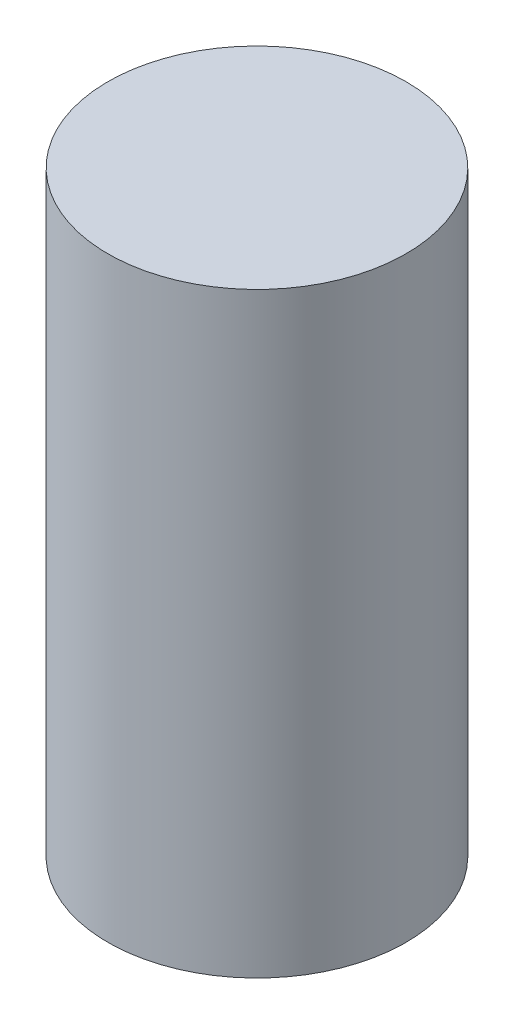
ISO-10303-21;
HEADER;
FILE_DESCRIPTION(('STEP AP214'),'2;1');
FILE_NAME('part.step','',(''),(''),'','','');
FILE_SCHEMA(('AUTOMOTIVE_DESIGN { 1 0 10303 214 1 1 1 1 }'));
ENDSEC;
DATA;
#1=APPLICATION_CONTEXT('core data for automotive mechanical design processes');
#2=APPLICATION_PROTOCOL_DEFINITION('international standard','automotive_design',2000,#1);
#3=PRODUCT_CONTEXT('',#1,'mechanical');
#4=PRODUCT('Part','Part','',(#3));
#5=PRODUCT_RELATED_PRODUCT_CATEGORY('part','',(#4));
#6=PRODUCT_DEFINITION_FORMATION('','',#4);
#7=PRODUCT_DEFINITION_CONTEXT('part definition',#1,'design');
#8=PRODUCT_DEFINITION('design','',#6,#7);
#9=PRODUCT_DEFINITION_SHAPE('','',#8);
#10=(LENGTH_UNIT() NAMED_UNIT(*) SI_UNIT(.MILLI.,.METRE.));
#11=(NAMED_UNIT(*) PLANE_ANGLE_UNIT() SI_UNIT($,.RADIAN.));
#12=(NAMED_UNIT(*) SI_UNIT($,.STERADIAN.) SOLID_ANGLE_UNIT());
#13=UNCERTAINTY_MEASURE_WITH_UNIT(LENGTH_MEASURE(1.E-05),#10,'distance_accuracy_value','');
#14=(GEOMETRIC_REPRESENTATION_CONTEXT(3) GLOBAL_UNCERTAINTY_ASSIGNED_CONTEXT((#13)) GLOBAL_UNIT_ASSIGNED_CONTEXT((#10,
#11,#12)) REPRESENTATION_CONTEXT('',''));
#15=CARTESIAN_POINT('',(0.,0.,0.));
#16=DIRECTION('',(0.,0.,1.));
#17=DIRECTION('',(1.,0.,0.));
#18=AXIS2_PLACEMENT_3D('',#15,#16,#17);
#19=CARTESIAN_POINT('',(0.,58.,0.));
#20=DIRECTION('',(0.,-1.,0.));
#21=DIRECTION('',(0.,0.,-1.));
#22=AXIS2_PLACEMENT_3D('',#19,#20,#21);
#23=CYLINDRICAL_SURFACE('',#22,14.5);
#24=CARTESIAN_POINT('',(0.,58.,0.));
#25=DIRECTION('',(0.,1.,0.));
#26=DIRECTION('',(0.,0.,1.));
#27=AXIS2_PLACEMENT_3D('',#24,#25,#26);
#28=CIRCLE('',#27,14.5);
#29=CARTESIAN_POINT('',(0.,58.,-14.5));
#30=VERTEX_POINT('',#29);
#31=EDGE_CURVE('E10',#30,#30,#28,.T.);
#32=CARTESIAN_POINT('',(0.,0.,0.));
#33=DIRECTION('',(0.,1.,0.));
#34=DIRECTION('',(0.,0.,1.));
#35=AXIS2_PLACEMENT_3D('',#32,#33,#34);
#36=CIRCLE('',#35,14.5);
#37=CARTESIAN_POINT('',(0.,0.,-14.5));
#38=VERTEX_POINT('',#37);
#39=EDGE_CURVE('E44',#38,#38,#36,.T.);
#40=CARTESIAN_POINT('',(0.,58.,-14.5));
#41=CARTESIAN_POINT('',(0.,57.3958333333333,-14.5));
#42=CARTESIAN_POINT('',(0.,56.7916666666667,-14.5));
#43=CARTESIAN_POINT('',(0.,55.5833333333333,-14.5));
#44=CARTESIAN_POINT('',(0.,54.9791666666667,-14.5));
#45=CARTESIAN_POINT('',(0.,53.7708333333333,-14.5));
#46=CARTESIAN_POINT('',(0.,53.1666666666667,-14.5));
#47=CARTESIAN_POINT('',(0.,51.9583333333333,-14.5));
#48=CARTESIAN_POINT('',(0.,51.3541666666667,-14.5));
#49=CARTESIAN_POINT('',(0.,50.1458333333333,-14.5));
#50=CARTESIAN_POINT('',(0.,49.5416666666667,-14.5));
#51=CARTESIAN_POINT('',(0.,48.3333333333333,-14.5));
#52=CARTESIAN_POINT('',(0.,47.7291666666667,-14.5));
#53=CARTESIAN_POINT('',(0.,46.5208333333333,-14.5));
#54=CARTESIAN_POINT('',(0.,45.9166666666667,-14.5));
#55=CARTESIAN_POINT('',(0.,44.7083333333333,-14.5));
#56=CARTESIAN_POINT('',(0.,44.1041666666667,-14.5));
#57=CARTESIAN_POINT('',(0.,42.8958333333333,-14.5));
#58=CARTESIAN_POINT('',(0.,42.2916666666667,-14.5));
#59=CARTESIAN_POINT('',(0.,41.0833333333333,-14.5));
#60=CARTESIAN_POINT('',(0.,40.4791666666667,-14.5));
#61=CARTESIAN_POINT('',(0.,39.2708333333333,-14.5));
#62=CARTESIAN_POINT('',(0.,38.6666666666667,-14.5));
#63=CARTESIAN_POINT('',(0.,37.4583333333333,-14.5));
#64=CARTESIAN_POINT('',(0.,36.8541666666667,-14.5));
#65=CARTESIAN_POINT('',(0.,35.6458333333333,-14.5));
#66=CARTESIAN_POINT('',(0.,35.0416666666667,-14.5));
#67=CARTESIAN_POINT('',(0.,33.8333333333333,-14.5));
#68=CARTESIAN_POINT('',(0.,33.2291666666667,-14.5));
#69=CARTESIAN_POINT('',(0.,32.0208333333333,-14.5));
#70=CARTESIAN_POINT('',(0.,31.4166666666667,-14.5));
#71=CARTESIAN_POINT('',(0.,30.2083333333333,-14.5));
#72=CARTESIAN_POINT('',(0.,29.6041666666667,-14.5));
#73=CARTESIAN_POINT('',(0.,28.3958333333333,-14.5));
#74=CARTESIAN_POINT('',(0.,27.7916666666667,-14.5));
#75=CARTESIAN_POINT('',(0.,26.5833333333333,-14.5));
#76=CARTESIAN_POINT('',(0.,25.9791666666667,-14.5));
#77=CARTESIAN_POINT('',(0.,24.7708333333333,-14.5));
#78=CARTESIAN_POINT('',(0.,24.1666666666667,-14.5));
#79=CARTESIAN_POINT('',(0.,22.9583333333333,-14.5));
#80=CARTESIAN_POINT('',(0.,22.3541666666667,-14.5));
#81=CARTESIAN_POINT('',(0.,21.1458333333333,-14.5));
#82=CARTESIAN_POINT('',(0.,20.5416666666667,-14.5));
#83=CARTESIAN_POINT('',(0.,19.3333333333333,-14.5));
#84=CARTESIAN_POINT('',(0.,18.7291666666667,-14.5));
#85=CARTESIAN_POINT('',(0.,17.5208333333333,-14.5));
#86=CARTESIAN_POINT('',(0.,16.9166666666667,-14.5));
#87=CARTESIAN_POINT('',(0.,15.7083333333333,-14.5));
#88=CARTESIAN_POINT('',(0.,15.1041666666667,-14.5));
#89=CARTESIAN_POINT('',(0.,13.8958333333333,-14.5));
#90=CARTESIAN_POINT('',(0.,13.2916666666667,-14.5));
#91=CARTESIAN_POINT('',(0.,12.0833333333333,-14.5));
#92=CARTESIAN_POINT('',(0.,11.4791666666667,-14.5));
#93=CARTESIAN_POINT('',(0.,10.2708333333333,-14.5));
#94=CARTESIAN_POINT('',(0.,9.66666666666667,-14.5));
#95=CARTESIAN_POINT('',(0.,8.45833333333333,-14.5));
#96=CARTESIAN_POINT('',(0.,7.85416666666667,-14.5));
#97=CARTESIAN_POINT('',(0.,6.64583333333333,-14.5));
#98=CARTESIAN_POINT('',(0.,6.04166666666667,-14.5));
#99=CARTESIAN_POINT('',(0.,4.83333333333333,-14.5));
#100=CARTESIAN_POINT('',(0.,4.22916666666667,-14.5));
#101=CARTESIAN_POINT('',(0.,3.02083333333334,-14.5));
#102=CARTESIAN_POINT('',(0.,2.41666666666667,-14.5));
#103=CARTESIAN_POINT('',(0.,1.20833333333333,-14.5));
#104=CARTESIAN_POINT('',(0.,0.604166666666666,-14.5));
#105=CARTESIAN_POINT('',(0.,0.,-14.5));
#106=B_SPLINE_CURVE_WITH_KNOTS('',3,(#40,#41,#42,#43,#44,#45,#46,#47,#48,#49,#50,#51,#52,#53,
#54,#55,#56,#57,#58,#59,#60,#61,#62,#63,#64,#65,#66,#67,#68,#69,#70,#71,#72,#73,#74,#75,#76,#77,
#78,#79,#80,#81,#82,#83,#84,#85,#86,#87,#88,#89,#90,#91,#92,#93,#94,#95,#96,#97,#98,#99,#100,
#101,#102,#103,#104,#105),.UNSPECIFIED.,.F.,.F.,(4,2,2,2,2,2,2,2,2,2,2,2,2,2,2,2,2,2,2,2,2,2,2,
2,2,2,2,2,2,2,2,2,4),(0.,1.81249999999999,3.625,5.4375,7.24999999999999,9.06249999999999,10.875,
12.6875,14.5,16.3125,18.125,19.9375,21.75,23.5625,25.375,27.1875,29.,30.8125,32.625,34.4375,
36.25,38.0625,39.875,41.6875,43.5,45.3125,47.125,48.9375,50.75,52.5625,54.375,56.1875,58.),.UNSPECIFIED.);
#107=EDGE_CURVE('BSEAM41',#30,#38,#106,.T.);
#108=ORIENTED_EDGE('',*,*,#31,.F.);
#109=ORIENTED_EDGE('',*,*,#39,.T.);
#110=ORIENTED_EDGE('',*,*,#107,.T.);
#111=ORIENTED_EDGE('',*,*,#107,.F.);
#112=EDGE_LOOP('',(#108,#110,#109,#111));
#113=FACE_BOUND('',#112,.T.);
#114=ADVANCED_FACE('F41',(#113),#23,.T.);
#115=CARTESIAN_POINT('',(0.,58.,0.));
#116=DIRECTION('',(0.,1.,0.));
#117=DIRECTION('',(0.,0.,1.));
#118=AXIS2_PLACEMENT_3D('',#115,#116,#117);
#119=PLANE('',#118);
#120=ORIENTED_EDGE('',*,*,#31,.T.);
#121=EDGE_LOOP('',(#120));
#122=FACE_BOUND('',#121,.T.);
#123=ADVANCED_FACE('F58',(#122),#119,.T.);
#124=CARTESIAN_POINT('',(0.,0.,0.));
#125=DIRECTION('',(0.,1.,0.));
#126=DIRECTION('',(0.,0.,1.));
#127=AXIS2_PLACEMENT_3D('',#124,#125,#126);
#128=PLANE('',#127);
#129=ORIENTED_EDGE('',*,*,#39,.F.);
#130=EDGE_LOOP('',(#129));
#131=FACE_BOUND('',#130,.T.);
#132=ADVANCED_FACE('F56',(#131),#128,.F.);
#133=CLOSED_SHELL('',(#114,#123,#132));
#134=MANIFOLD_SOLID_BREP('B2',#133);
#135=ADVANCED_BREP_SHAPE_REPRESENTATION('',(#18,#134),#14);
#136=SHAPE_DEFINITION_REPRESENTATION(#9,#135);
ENDSEC;
END-ISO-10303-21;
